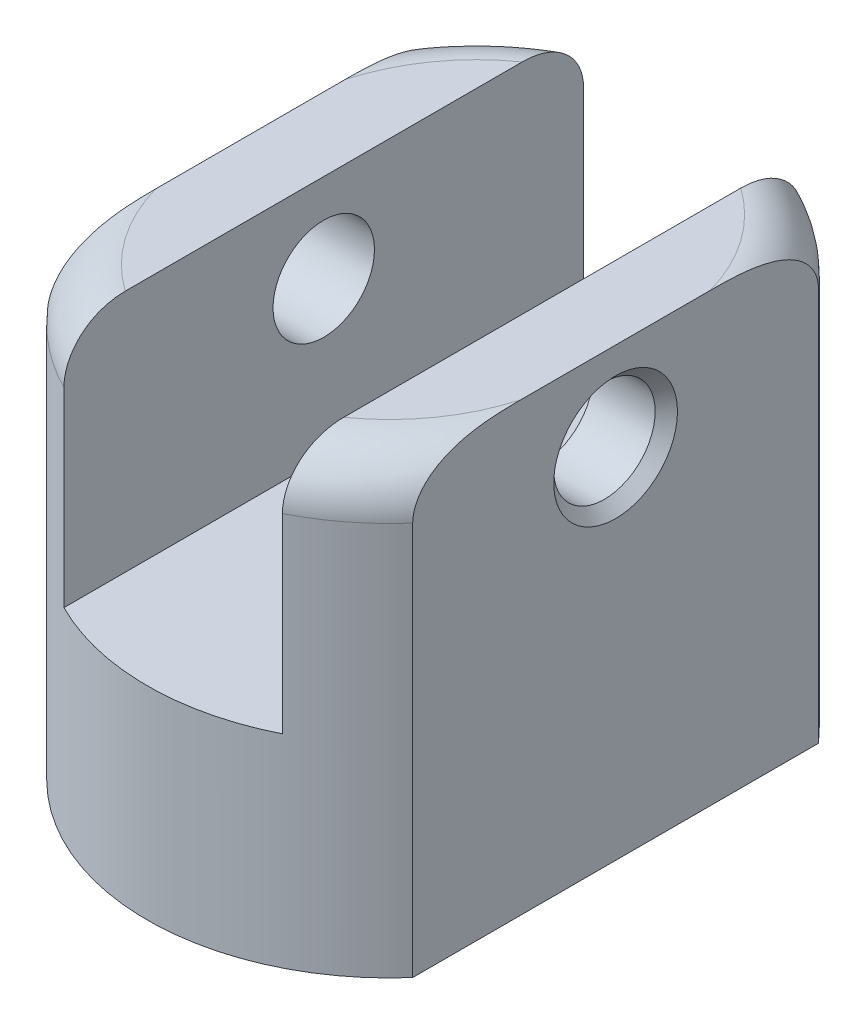
ISO-10303-21;
HEADER;
FILE_DESCRIPTION(('STEP AP214'),'2;1');
FILE_NAME('part.step','',(''),(''),'','','');
FILE_SCHEMA(('AUTOMOTIVE_DESIGN { 1 0 10303 214 1 1 1 1 }'));
ENDSEC;
DATA;
#1=APPLICATION_CONTEXT('core data for automotive mechanical design processes');
#2=APPLICATION_PROTOCOL_DEFINITION('international standard','automotive_design',2000,#1);
#3=PRODUCT_CONTEXT('',#1,'mechanical');
#4=PRODUCT('Part','Part','',(#3));
#5=PRODUCT_RELATED_PRODUCT_CATEGORY('part','',(#4));
#6=PRODUCT_DEFINITION_FORMATION('','',#4);
#7=PRODUCT_DEFINITION_CONTEXT('part definition',#1,'design');
#8=PRODUCT_DEFINITION('design','',#6,#7);
#9=PRODUCT_DEFINITION_SHAPE('','',#8);
#10=(LENGTH_UNIT() NAMED_UNIT(*) SI_UNIT(.MILLI.,.METRE.));
#11=(NAMED_UNIT(*) PLANE_ANGLE_UNIT() SI_UNIT($,.RADIAN.));
#12=(NAMED_UNIT(*) SI_UNIT($,.STERADIAN.) SOLID_ANGLE_UNIT());
#13=UNCERTAINTY_MEASURE_WITH_UNIT(LENGTH_MEASURE(1.E-05),#10,'distance_accuracy_value','');
#14=(GEOMETRIC_REPRESENTATION_CONTEXT(3) GLOBAL_UNCERTAINTY_ASSIGNED_CONTEXT((#13)) GLOBAL_UNIT_ASSIGNED_CONTEXT((#10,
#11,#12)) REPRESENTATION_CONTEXT('',''));
#15=CARTESIAN_POINT('',(0.,0.,0.));
#16=DIRECTION('',(0.,0.,1.));
#17=DIRECTION('',(1.,0.,0.));
#18=AXIS2_PLACEMENT_3D('',#15,#16,#17);
#19=CARTESIAN_POINT('',(0.,5.,-3.93010790379543));
#20=DIRECTION('',(0.,-1.,0.));
#21=DIRECTION('',(0.,0.,-1.));
#22=AXIS2_PLACEMENT_3D('',#19,#20,#21);
#23=CYLINDRICAL_SURFACE('',#22,5.97459188024381);
#24=DIRECTION('',(0.,-1.,0.));
#25=VECTOR('',#24,1.);
#26=CARTESIAN_POINT('',(4.5,5.,0.));
#27=LINE('',#26,#25);
#28=CARTESIAN_POINT('',(4.5,9.7,0.));
#29=VERTEX_POINT('',#28);
#30=CARTESIAN_POINT('',(4.5,0.,0.));
#31=VERTEX_POINT('',#30);
#32=EDGE_CURVE('E196',#29,#31,#27,.T.);
#33=ORIENTED_EDGE('',*,*,#32,.F.);
#34=CARTESIAN_POINT('',(0.,9.7,-3.93010790379543));
#35=DIRECTION('',(0.,-1.,0.));
#36=DIRECTION('',(0.,0.,-1.));
#37=AXIS2_PLACEMENT_3D('',#34,#35,#36);
#38=CIRCLE('',#37,5.97459188024381);
#39=CARTESIAN_POINT('',(2.69256177348422,9.7,1.40335806417013));
#40=VERTEX_POINT('',#39);
#41=EDGE_CURVE('E331',#29,#40,#38,.T.);
#42=ORIENTED_EDGE('',*,*,#41,.T.);
#43=DIRECTION('',(0.,-1.,0.));
#44=VECTOR('',#43,1.);
#45=CARTESIAN_POINT('',(2.69256177348422,11.,1.40335806417013));
#46=LINE('',#45,#44);
#47=CARTESIAN_POINT('',(2.69256177348422,5.,1.40335806417013));
#48=VERTEX_POINT('',#47);
#49=EDGE_CURVE('E171',#40,#48,#46,.T.);
#50=ORIENTED_EDGE('',*,*,#49,.T.);
#51=CARTESIAN_POINT('',(0.,5.,-3.93010790379543));
#52=DIRECTION('',(0.,1.,0.));
#53=DIRECTION('',(0.,0.,1.));
#54=AXIS2_PLACEMENT_3D('',#51,#52,#53);
#55=CIRCLE('',#54,5.97459188024381);
#56=CARTESIAN_POINT('',(-2.69256177348422,5.,1.40335806417013));
#57=VERTEX_POINT('',#56);
#58=EDGE_CURVE('E155',#57,#48,#55,.T.);
#59=ORIENTED_EDGE('',*,*,#58,.F.);
#60=DIRECTION('',(0.,-1.,0.));
#61=VECTOR('',#60,1.);
#62=CARTESIAN_POINT('',(-2.69256177348422,11.,1.40335806417013));
#63=LINE('',#62,#61);
#64=CARTESIAN_POINT('',(-2.69256177348422,9.7,1.40335806417013));
#65=VERTEX_POINT('',#64);
#66=EDGE_CURVE('E142',#65,#57,#63,.T.);
#67=ORIENTED_EDGE('',*,*,#66,.F.);
#68=CARTESIAN_POINT('',(0.,9.7,-3.93010790379543));
#69=DIRECTION('',(0.,1.,0.));
#70=DIRECTION('',(0.,0.,1.));
#71=AXIS2_PLACEMENT_3D('',#68,#69,#70);
#72=CIRCLE('',#71,5.97459188024381);
#73=CARTESIAN_POINT('',(-4.5,9.7,0.));
#74=VERTEX_POINT('',#73);
#75=EDGE_CURVE('E333',#65,#74,#72,.F.);
#76=ORIENTED_EDGE('',*,*,#75,.T.);
#77=DIRECTION('',(0.,-1.,0.));
#78=VECTOR('',#77,1.);
#79=CARTESIAN_POINT('',(-4.5,5.,0.));
#80=LINE('',#79,#78);
#81=CARTESIAN_POINT('',(-4.5,0.,0.));
#82=VERTEX_POINT('',#81);
#83=EDGE_CURVE('E154',#74,#82,#80,.T.);
#84=ORIENTED_EDGE('',*,*,#83,.T.);
#85=CARTESIAN_POINT('',(0.,0.,-3.93010790379543));
#86=DIRECTION('',(0.,1.,0.));
#87=DIRECTION('',(0.,0.,1.));
#88=AXIS2_PLACEMENT_3D('',#85,#86,#87);
#89=CIRCLE('',#88,5.97459188024381);
#90=EDGE_CURVE('E168',#82,#31,#89,.T.);
#91=ORIENTED_EDGE('',*,*,#90,.T.);
#92=EDGE_LOOP('',(#33,#42,#50,#59,#67,#76,#84,#91));
#93=FACE_BOUND('',#92,.T.);
#94=ADVANCED_FACE('F43',(#93),#23,.T.);
#95=CARTESIAN_POINT('',(4.5,5.,0.));
#96=DIRECTION('',(-1.,0.,0.));
#97=DIRECTION('',(0.,0.,1.));
#98=AXIS2_PLACEMENT_3D('',#95,#96,#97);
#99=PLANE('',#98);
#100=CARTESIAN_POINT('',(4.5,8.81884783153052,-5.));
#101=DIRECTION('',(1.,0.,0.));
#102=DIRECTION('',(0.,0.,-1.));
#103=AXIS2_PLACEMENT_3D('',#100,#101,#102);
#104=CIRCLE('',#103,1.525);
#105=CARTESIAN_POINT('',(4.5,8.81884783153052,-6.525));
#106=VERTEX_POINT('',#105);
#107=EDGE_CURVE('E360',#106,#106,#104,.T.);
#108=ORIENTED_EDGE('',*,*,#107,.F.);
#109=EDGE_LOOP('',(#108));
#110=FACE_BOUND('',#109,.T.);
#111=DIRECTION('',(0.,0.,-1.));
#112=VECTOR('',#111,1.);
#113=CARTESIAN_POINT('',(4.5,11.,-10.));
#114=LINE('',#113,#112);
#115=CARTESIAN_POINT('',(4.5,11.,-2.66448187417949));
#116=VERTEX_POINT('',#115);
#117=CARTESIAN_POINT('',(4.5,11.,-7.33551812582051));
#118=VERTEX_POINT('',#117);
#119=EDGE_CURVE('E173',#116,#118,#114,.T.);
#120=ORIENTED_EDGE('',*,*,#119,.F.);
#121=CARTESIAN_POINT('',(4.5,11.,-2.66448187417949));
#122=CARTESIAN_POINT('',(4.5,10.9999579121948,-2.55721604428464));
#123=CARTESIAN_POINT('',(4.5,10.9990249247275,-2.44989611380565));
#124=CARTESIAN_POINT('',(4.5,10.9936863313358,-2.23497742128847));
#125=CARTESIAN_POINT('',(4.5,10.9892686333236,-2.12737899112895));
#126=CARTESIAN_POINT('',(4.5,10.9751204791902,-1.91055119010271));
#127=CARTESIAN_POINT('',(4.5,10.9652959213955,-1.80132728218169));
#128=CARTESIAN_POINT('',(4.5,10.9381548415997,-1.58392520500035));
#129=CARTESIAN_POINT('',(4.5,10.9208496516396,-1.47574570602313));
#130=CARTESIAN_POINT('',(4.5,10.8769295805703,-1.26434897871217));
#131=CARTESIAN_POINT('',(4.5,10.8505863707531,-1.16107735247381));
#132=CARTESIAN_POINT('',(4.5,10.7859985310876,-0.95851005137638));
#133=CARTESIAN_POINT('',(4.5,10.7477915897003,-0.85920289418209));
#134=CARTESIAN_POINT('',(4.5,10.6647247234272,-0.68449316896437));
#135=CARTESIAN_POINT('',(4.5,10.6222478314166,-0.607975418394366));
#136=CARTESIAN_POINT('',(4.5,10.5257477093161,-0.462490874733668));
#137=CARTESIAN_POINT('',(4.5,10.4717423395854,-0.393512648257315));
#138=CARTESIAN_POINT('',(4.5,10.3697128469543,-0.28669384561602));
#139=CARTESIAN_POINT('',(4.5,10.324913840388,-0.245783392721529));
#140=CARTESIAN_POINT('',(4.5,10.2293848147684,-0.171530438212447));
#141=CARTESIAN_POINT('',(4.5,10.1786608124376,-0.138180358691917));
#142=CARTESIAN_POINT('',(4.5,10.0800092926009,-0.0853978250752117));
#143=CARTESIAN_POINT('',(4.5,10.0327986058323,-0.0646296827384352));
#144=CARTESIAN_POINT('',(4.5,9.93558660259112,-0.0313069185272241));
#145=CARTESIAN_POINT('',(4.5,9.88559082644872,-0.01873658058308));
#146=CARTESIAN_POINT('',(4.5,9.81261753340674,-0.00713469799353471));
#147=CARTESIAN_POINT('',(4.5,9.79017466386443,-0.00446323250953511));
#148=CARTESIAN_POINT('',(4.5,9.74515841519744,-0.000895803752150439));
#149=CARTESIAN_POINT('',(4.5,9.72258509819915,9.44439139875433E-07));
#150=CARTESIAN_POINT('',(4.5,9.7,0.));
#151=B_SPLINE_CURVE_WITH_KNOTS('',3,(#121,#122,#123,#124,#125,#126,#127,#128,#129,#130,#131,
#132,#133,#134,#135,#136,#137,#138,#139,#140,#141,#142,#143,#144,#145,#146,#147,#148,#149,#150),
.UNSPECIFIED.,.F.,.F.,(4,2,2,2,2,2,2,2,2,2,2,2,2,2,4),(0.,0.321878742921493,0.644879358068709,
0.973687927740611,1.30200013749144,1.62120164235244,1.93939931314231,2.20114254324101,
2.46248317606112,2.64386775823326,2.82506972334543,2.97916426119044,3.13296250803396,
3.20070705697702,3.26842163731411),.UNSPECIFIED.);
#152=EDGE_CURVE('E212',#116,#29,#151,.T.);
#153=ORIENTED_EDGE('',*,*,#152,.T.);
#154=ORIENTED_EDGE('',*,*,#32,.T.);
#155=DIRECTION('',(0.,0.,-1.));
#156=VECTOR('',#155,1.);
#157=CARTESIAN_POINT('',(4.5,0.,0.));
#158=LINE('',#157,#156);
#159=CARTESIAN_POINT('',(4.5,0.,-10.));
#160=VERTEX_POINT('',#159);
#161=EDGE_CURVE('E183',#31,#160,#158,.T.);
#162=ORIENTED_EDGE('',*,*,#161,.T.);
#163=DIRECTION('',(0.,-1.,0.));
#164=VECTOR('',#163,1.);
#165=CARTESIAN_POINT('',(4.5,5.,-10.));
#166=LINE('',#165,#164);
#167=CARTESIAN_POINT('',(4.5,9.7,-10.));
#168=VERTEX_POINT('',#167);
#169=EDGE_CURVE('E194',#168,#160,#166,.T.);
#170=ORIENTED_EDGE('',*,*,#169,.F.);
#171=CARTESIAN_POINT('',(4.5,9.7,-10.));
#172=CARTESIAN_POINT('',(4.5,9.72733090783955,-10.0000047047525));
#173=CARTESIAN_POINT('',(4.5,9.75464478026116,-9.9986885596798));
#174=CARTESIAN_POINT('',(4.5,9.80900483720851,-9.99347201786908));
#175=CARTESIAN_POINT('',(4.5,9.83605120434967,-9.98957352832161));
#176=CARTESIAN_POINT('',(4.5,9.91600090924396,-9.97418364695842));
#177=CARTESIAN_POINT('',(4.5,9.9682307709006,-9.95899539511455));
#178=CARTESIAN_POINT('',(4.5,10.0690705493207,-9.91989447850897));
#179=CARTESIAN_POINT('',(4.5,10.1176895456887,-9.8960046546433));
#180=CARTESIAN_POINT('',(4.5,10.2106744455297,-9.84091029559183));
#181=CARTESIAN_POINT('',(4.5,10.2550305369458,-9.80968942894652));
#182=CARTESIAN_POINT('',(4.5,10.3555240260043,-9.72796077291403));
#183=CARTESIAN_POINT('',(4.5,10.4094179177737,-9.67470046463676));
#184=CARTESIAN_POINT('',(4.5,10.5079488884731,-9.56034581127658));
#185=CARTESIAN_POINT('',(4.5,10.5525767422687,-9.49924375603809));
#186=CARTESIAN_POINT('',(4.5,10.6548092426531,-9.33791127604358));
#187=CARTESIAN_POINT('',(4.5,10.7067583533449,-9.2341043453775));
#188=CARTESIAN_POINT('',(4.5,10.7726106143044,-9.07334225145411));
#189=CARTESIAN_POINT('',(4.5,10.7926082649215,-9.01867005432249));
#190=CARTESIAN_POINT('',(4.5,10.8289559665313,-8.90813296909866));
#191=CARTESIAN_POINT('',(4.5,10.845307398349,-8.85226854131669));
#192=CARTESIAN_POINT('',(4.5,10.8916851049158,-8.67533214421918));
#193=CARTESIAN_POINT('',(4.5,10.9159616737409,-8.55275875961463));
#194=CARTESIAN_POINT('',(4.5,10.9537131362733,-8.30578537036689));
#195=CARTESIAN_POINT('',(4.5,10.9671592785388,-8.18138139063602));
#196=CARTESIAN_POINT('',(4.5,10.9861045566522,-7.93641050029632));
#197=CARTESIAN_POINT('',(4.5,10.9918661760798,-7.81586225205154));
#198=CARTESIAN_POINT('',(4.5,10.9970699359626,-7.63531636318941));
#199=CARTESIAN_POINT('',(4.5,10.998232964284,-7.57535362511535));
#200=CARTESIAN_POINT('',(4.5,10.9996963268643,-7.45543320140376));
#201=CARTESIAN_POINT('',(4.5,10.9999968943528,-7.39547551878566));
#202=CARTESIAN_POINT('',(4.5,11.,-7.33551812582051));
#203=B_SPLINE_CURVE_WITH_KNOTS('',3,(#171,#172,#173,#174,#175,#176,#177,#178,#179,#180,#181,
#182,#183,#184,#185,#186,#187,#188,#189,#190,#191,#192,#193,#194,#195,#196,#197,#198,#199,#200,
#201,#202),.UNSPECIFIED.,.F.,.F.,(4,2,2,2,2,2,2,2,2,2,2,2,2,2,2,4),(0.,0.0819287032707459,
0.163796965461516,0.326010462989273,0.487801196599493,0.649955831433167,0.875997141181808,
1.10226242660355,1.44843033047372,1.62300215620742,1.79750775879397,2.17160379172487,
2.54668969102926,2.90860421367894,3.08852303005002,3.26839318757344),.UNSPECIFIED.);
#204=EDGE_CURVE('E204',#168,#118,#203,.T.);
#205=ORIENTED_EDGE('',*,*,#204,.T.);
#206=EDGE_LOOP('',(#120,#153,#154,#162,#170,#205));
#207=FACE_BOUND('',#206,.T.);
#208=ADVANCED_FACE('F221',(#110,#207),#99,.F.);
#209=CARTESIAN_POINT('',(0.,5.,-6.06989209620457));
#210=DIRECTION('',(0.,-1.,0.));
#211=DIRECTION('',(0.,0.,-1.));
#212=AXIS2_PLACEMENT_3D('',#209,#210,#211);
#213=CYLINDRICAL_SURFACE('',#212,5.97459188024381);
#214=DIRECTION('',(0.,-1.,0.));
#215=VECTOR('',#214,1.);
#216=CARTESIAN_POINT('',(2.69256177348422,11.,-11.4033580641701));
#217=LINE('',#216,#215);
#218=CARTESIAN_POINT('',(2.69256177348422,9.7,-11.4033580641701));
#219=VERTEX_POINT('',#218);
#220=CARTESIAN_POINT('',(2.69256177348422,5.,-11.4033580641701));
#221=VERTEX_POINT('',#220);
#222=EDGE_CURVE('E169',#219,#221,#217,.T.);
#223=ORIENTED_EDGE('',*,*,#222,.F.);
#224=CARTESIAN_POINT('',(0.,9.7,-6.06989209620457));
#225=DIRECTION('',(0.,-1.,0.));
#226=DIRECTION('',(0.,0.,-1.));
#227=AXIS2_PLACEMENT_3D('',#224,#225,#226);
#228=CIRCLE('',#227,5.97459188024381);
#229=EDGE_CURVE('E315',#219,#168,#228,.T.);
#230=ORIENTED_EDGE('',*,*,#229,.T.);
#231=ORIENTED_EDGE('',*,*,#169,.T.);
#232=CARTESIAN_POINT('',(0.,0.,-6.06989209620457));
#233=DIRECTION('',(0.,1.,0.));
#234=DIRECTION('',(0.,0.,-1.));
#235=AXIS2_PLACEMENT_3D('',#232,#233,#234);
#236=CIRCLE('',#235,5.97459188024381);
#237=CARTESIAN_POINT('',(-4.5,0.,-10.));
#238=VERTEX_POINT('',#237);
#239=EDGE_CURVE('E186',#160,#238,#236,.T.);
#240=ORIENTED_EDGE('',*,*,#239,.T.);
#241=DIRECTION('',(0.,-1.,0.));
#242=VECTOR('',#241,1.);
#243=CARTESIAN_POINT('',(-4.5,5.,-10.));
#244=LINE('',#243,#242);
#245=CARTESIAN_POINT('',(-4.5,9.7,-10.));
#246=VERTEX_POINT('',#245);
#247=EDGE_CURVE('E192',#246,#238,#244,.T.);
#248=ORIENTED_EDGE('',*,*,#247,.F.);
#249=CARTESIAN_POINT('',(0.,9.7,-6.06989209620457));
#250=DIRECTION('',(0.,1.,0.));
#251=DIRECTION('',(0.,0.,1.));
#252=AXIS2_PLACEMENT_3D('',#249,#250,#251);
#253=CIRCLE('',#252,5.97459188024381);
#254=CARTESIAN_POINT('',(-2.69256177348422,9.7,-11.4033580641701));
#255=VERTEX_POINT('',#254);
#256=EDGE_CURVE('E140',#246,#255,#253,.F.);
#257=ORIENTED_EDGE('',*,*,#256,.T.);
#258=DIRECTION('',(0.,-1.,0.));
#259=VECTOR('',#258,1.);
#260=CARTESIAN_POINT('',(-2.69256177348422,11.,-11.4033580641701));
#261=LINE('',#260,#259);
#262=CARTESIAN_POINT('',(-2.69256177348422,5.,-11.4033580641701));
#263=VERTEX_POINT('',#262);
#264=EDGE_CURVE('E133',#255,#263,#261,.T.);
#265=ORIENTED_EDGE('',*,*,#264,.T.);
#266=CARTESIAN_POINT('',(0.,5.,-6.06989209620457));
#267=DIRECTION('',(0.,1.,0.));
#268=DIRECTION('',(0.,0.,-1.));
#269=AXIS2_PLACEMENT_3D('',#266,#267,#268);
#270=CIRCLE('',#269,5.97459188024381);
#271=EDGE_CURVE('E137',#221,#263,#270,.T.);
#272=ORIENTED_EDGE('',*,*,#271,.F.);
#273=EDGE_LOOP('',(#223,#230,#231,#240,#248,#257,#265,#272));
#274=FACE_BOUND('',#273,.T.);
#275=ADVANCED_FACE('F136',(#274),#213,.T.);
#276=CARTESIAN_POINT('',(-4.5,5.,0.));
#277=DIRECTION('',(1.,0.,0.));
#278=DIRECTION('',(0.,0.,-1.));
#279=AXIS2_PLACEMENT_3D('',#276,#277,#278);
#280=PLANE('',#279);
#281=CARTESIAN_POINT('',(-4.5,8.81884783153052,-5.));
#282=DIRECTION('',(1.,0.,0.));
#283=DIRECTION('',(0.,0.,-1.));
#284=AXIS2_PLACEMENT_3D('',#281,#282,#283);
#285=CIRCLE('',#284,1.25);
#286=CARTESIAN_POINT('',(-4.5,8.81884783153052,-6.25));
#287=VERTEX_POINT('',#286);
#288=EDGE_CURVE('E362',#287,#287,#285,.T.);
#289=ORIENTED_EDGE('',*,*,#288,.T.);
#290=EDGE_LOOP('',(#289));
#291=FACE_BOUND('',#290,.T.);
#292=DIRECTION('',(0.,0.,1.));
#293=VECTOR('',#292,1.);
#294=CARTESIAN_POINT('',(-4.5,11.,-10.));
#295=LINE('',#294,#293);
#296=CARTESIAN_POINT('',(-4.5,11.,-7.33551812582051));
#297=VERTEX_POINT('',#296);
#298=CARTESIAN_POINT('',(-4.5,11.,-2.66448187417949));
#299=VERTEX_POINT('',#298);
#300=EDGE_CURVE('E159',#297,#299,#295,.T.);
#301=ORIENTED_EDGE('',*,*,#300,.F.);
#302=CARTESIAN_POINT('',(-4.5,11.,-7.33551812582051));
#303=CARTESIAN_POINT('',(-4.5,10.9999579121948,-7.44278395571536));
#304=CARTESIAN_POINT('',(-4.5,10.9990249247275,-7.55010388619435));
#305=CARTESIAN_POINT('',(-4.5,10.9936863313358,-7.76502257871152));
#306=CARTESIAN_POINT('',(-4.5,10.9892686333236,-7.87262100887105));
#307=CARTESIAN_POINT('',(-4.5,10.9751204791902,-8.08944880989729));
#308=CARTESIAN_POINT('',(-4.5,10.9652959213955,-8.19867271781831));
#309=CARTESIAN_POINT('',(-4.5,10.9381548415997,-8.41607479499965));
#310=CARTESIAN_POINT('',(-4.5,10.9208496516396,-8.52425429397687));
#311=CARTESIAN_POINT('',(-4.5,10.8769295805703,-8.73565102128783));
#312=CARTESIAN_POINT('',(-4.5,10.8505863707531,-8.83892264752619));
#313=CARTESIAN_POINT('',(-4.5,10.7859985310876,-9.04148994862362));
#314=CARTESIAN_POINT('',(-4.5,10.7477915897003,-9.14079710581791));
#315=CARTESIAN_POINT('',(-4.5,10.6647247234272,-9.31550683103563));
#316=CARTESIAN_POINT('',(-4.5,10.6222478314166,-9.39202458160564));
#317=CARTESIAN_POINT('',(-4.5,10.5257477093161,-9.53750912526633));
#318=CARTESIAN_POINT('',(-4.5,10.4717423395854,-9.60648735174269));
#319=CARTESIAN_POINT('',(-4.5,10.3697128469543,-9.71330615438398));
#320=CARTESIAN_POINT('',(-4.5,10.324913840388,-9.75421660727847));
#321=CARTESIAN_POINT('',(-4.5,10.2293848147684,-9.82846956178755));
#322=CARTESIAN_POINT('',(-4.5,10.1786608124376,-9.86181964130808));
#323=CARTESIAN_POINT('',(-4.5,10.0800092926009,-9.91460217492479));
#324=CARTESIAN_POINT('',(-4.5,10.0327986058323,-9.93537031726157));
#325=CARTESIAN_POINT('',(-4.5,9.93558660259112,-9.96869308147278));
#326=CARTESIAN_POINT('',(-4.5,9.88559082644871,-9.98126341941692));
#327=CARTESIAN_POINT('',(-4.5,9.81261753340674,-9.99286530200646));
#328=CARTESIAN_POINT('',(-4.5,9.79017466386443,-9.99553676749046));
#329=CARTESIAN_POINT('',(-4.5,9.74515841519744,-9.99910419624785));
#330=CARTESIAN_POINT('',(-4.5,9.72258509819915,-10.0000009444391));
#331=CARTESIAN_POINT('',(-4.5,9.7,-10.));
#332=B_SPLINE_CURVE_WITH_KNOTS('',3,(#302,#303,#304,#305,#306,#307,#308,#309,#310,#311,#312,
#313,#314,#315,#316,#317,#318,#319,#320,#321,#322,#323,#324,#325,#326,#327,#328,#329,#330,#331),
.UNSPECIFIED.,.F.,.F.,(4,2,2,2,2,2,2,2,2,2,2,2,2,2,4),(0.,0.32187874292149,0.644879358068706,
0.973687927740607,1.30200013749143,1.62120164235244,1.93939931314231,2.20114254324101,
2.46248317606112,2.64386775823326,2.82506972334543,2.97916426119044,3.13296250803396,
3.20070705697702,3.26842163731411),.UNSPECIFIED.);
#333=EDGE_CURVE('E284',#297,#246,#332,.T.);
#334=ORIENTED_EDGE('',*,*,#333,.T.);
#335=ORIENTED_EDGE('',*,*,#247,.T.);
#336=DIRECTION('',(0.,0.,1.));
#337=VECTOR('',#336,1.);
#338=CARTESIAN_POINT('',(-4.5,0.,0.));
#339=LINE('',#338,#337);
#340=EDGE_CURVE('E179',#238,#82,#339,.T.);
#341=ORIENTED_EDGE('',*,*,#340,.T.);
#342=ORIENTED_EDGE('',*,*,#83,.F.);
#343=CARTESIAN_POINT('',(-4.5,9.7,0.));
#344=CARTESIAN_POINT('',(-4.5,9.72733090783955,4.70475250932631E-06));
#345=CARTESIAN_POINT('',(-4.5,9.75464478026116,-0.00131144032019838));
#346=CARTESIAN_POINT('',(-4.5,9.80900483720851,-0.006527982130916));
#347=CARTESIAN_POINT('',(-4.5,9.83605120434967,-0.010426471678393));
#348=CARTESIAN_POINT('',(-4.5,9.91600090924396,-0.0258163530415726));
#349=CARTESIAN_POINT('',(-4.5,9.9682307709006,-0.0410046048854452));
#350=CARTESIAN_POINT('',(-4.5,10.0690705493207,-0.0801055214910304));
#351=CARTESIAN_POINT('',(-4.5,10.1176895456887,-0.103995345356704));
#352=CARTESIAN_POINT('',(-4.5,10.2106744455297,-0.159089704408168));
#353=CARTESIAN_POINT('',(-4.5,10.2550305369458,-0.190310571053476));
#354=CARTESIAN_POINT('',(-4.5,10.3555240260043,-0.272039227085967));
#355=CARTESIAN_POINT('',(-4.5,10.4094179177737,-0.325299535363239));
#356=CARTESIAN_POINT('',(-4.5,10.5079488884731,-0.439654188723425));
#357=CARTESIAN_POINT('',(-4.5,10.5525767422687,-0.500756243961912));
#358=CARTESIAN_POINT('',(-4.5,10.6548092426531,-0.662088723956429));
#359=CARTESIAN_POINT('',(-4.5,10.7067583533449,-0.765895654622503));
#360=CARTESIAN_POINT('',(-4.5,10.7726106143044,-0.926657748545895));
#361=CARTESIAN_POINT('',(-4.5,10.7926082649215,-0.981329945677521));
#362=CARTESIAN_POINT('',(-4.5,10.8289559665313,-1.09186703090135));
#363=CARTESIAN_POINT('',(-4.5,10.845307398349,-1.14773145868332));
#364=CARTESIAN_POINT('',(-4.5,10.8916851049158,-1.32466785578083));
#365=CARTESIAN_POINT('',(-4.5,10.9159616737409,-1.44724124038538));
#366=CARTESIAN_POINT('',(-4.5,10.9537131362733,-1.69421462963312));
#367=CARTESIAN_POINT('',(-4.5,10.9671592785388,-1.81861860936399));
#368=CARTESIAN_POINT('',(-4.5,10.9861045566522,-2.06358949970369));
#369=CARTESIAN_POINT('',(-4.5,10.9918661760798,-2.18413774794846));
#370=CARTESIAN_POINT('',(-4.5,10.9970699359626,-2.36468363681059));
#371=CARTESIAN_POINT('',(-4.5,10.998232964284,-2.42464637488465));
#372=CARTESIAN_POINT('',(-4.5,10.9996963268643,-2.54456679859624));
#373=CARTESIAN_POINT('',(-4.5,10.9999968943528,-2.60452448121434));
#374=CARTESIAN_POINT('',(-4.5,11.,-2.66448187417949));
#375=B_SPLINE_CURVE_WITH_KNOTS('',3,(#343,#344,#345,#346,#347,#348,#349,#350,#351,#352,#353,
#354,#355,#356,#357,#358,#359,#360,#361,#362,#363,#364,#365,#366,#367,#368,#369,#370,#371,#372,
#373,#374),.UNSPECIFIED.,.F.,.F.,(4,2,2,2,2,2,2,2,2,2,2,2,2,2,2,4),(0.,0.0819287032707458,
0.163796965461517,0.326010462989273,0.487801196599491,0.649955831433167,0.875997141181811,
1.10226242660355,1.44843033047373,1.62300215620743,1.79750775879398,2.17160379172488,
2.54668969102927,2.90860421367894,3.08852303005002,3.26839318757344),.UNSPECIFIED.);
#376=EDGE_CURVE('E277',#74,#299,#375,.T.);
#377=ORIENTED_EDGE('',*,*,#376,.T.);
#378=EDGE_LOOP('',(#301,#334,#335,#341,#342,#377));
#379=FACE_BOUND('',#378,.T.);
#380=ADVANCED_FACE('F269',(#291,#379),#280,.F.);
#381=CARTESIAN_POINT('',(0.,5.,-3.93010790379543));
#382=DIRECTION('',(0.,1.,0.));
#383=DIRECTION('',(0.,0.,1.));
#384=AXIS2_PLACEMENT_3D('',#381,#382,#383);
#385=PLANE('',#384);
#386=DIRECTION('',(0.,0.,-1.));
#387=VECTOR('',#386,1.);
#388=CARTESIAN_POINT('',(-2.69256177348422,5.,-11.4033580641701));
#389=LINE('',#388,#387);
#390=EDGE_CURVE('E150',#57,#263,#389,.T.);
#391=ORIENTED_EDGE('',*,*,#390,.F.);
#392=ORIENTED_EDGE('',*,*,#58,.T.);
#393=DIRECTION('',(0.,0.,1.));
#394=VECTOR('',#393,1.);
#395=CARTESIAN_POINT('',(2.69256177348422,5.,-11.4033580641701));
#396=LINE('',#395,#394);
#397=EDGE_CURVE('E153',#221,#48,#396,.T.);
#398=ORIENTED_EDGE('',*,*,#397,.F.);
#399=ORIENTED_EDGE('',*,*,#271,.T.);
#400=EDGE_LOOP('',(#391,#392,#398,#399));
#401=FACE_BOUND('',#400,.T.);
#402=ADVANCED_FACE('F148',(#401),#385,.T.);
#403=CARTESIAN_POINT('',(0.,0.,-3.93010790379543));
#404=DIRECTION('',(0.,1.,0.));
#405=DIRECTION('',(0.,0.,1.));
#406=AXIS2_PLACEMENT_3D('',#403,#404,#405);
#407=PLANE('',#406);
#408=ORIENTED_EDGE('',*,*,#90,.F.);
#409=ORIENTED_EDGE('',*,*,#340,.F.);
#410=ORIENTED_EDGE('',*,*,#239,.F.);
#411=ORIENTED_EDGE('',*,*,#161,.F.);
#412=EDGE_LOOP('',(#408,#409,#410,#411));
#413=FACE_BOUND('',#412,.T.);
#414=ADVANCED_FACE('F259',(#413),#407,.F.);
#415=CARTESIAN_POINT('',(2.69256177348422,11.,-11.4033580641701));
#416=DIRECTION('',(1.,0.,0.));
#417=DIRECTION('',(0.,0.,-1.));
#418=AXIS2_PLACEMENT_3D('',#415,#416,#417);
#419=PLANE('',#418);
#420=CARTESIAN_POINT('',(2.69256177348422,8.81884783153052,-5.));
#421=DIRECTION('',(1.,0.,0.));
#422=DIRECTION('',(0.,0.,-1.));
#423=AXIS2_PLACEMENT_3D('',#420,#421,#422);
#424=CIRCLE('',#423,1.25);
#425=CARTESIAN_POINT('',(2.69256177348422,8.81884783153052,-6.25));
#426=VERTEX_POINT('',#425);
#427=EDGE_CURVE('E172',#426,#426,#424,.T.);
#428=ORIENTED_EDGE('',*,*,#427,.T.);
#429=EDGE_LOOP('',(#428));
#430=FACE_BOUND('',#429,.T.);
#431=ORIENTED_EDGE('',*,*,#49,.F.);
#432=CARTESIAN_POINT('',(2.69256177348422,9.7,1.40335806417013));
#433=CARTESIAN_POINT('',(2.69256177348422,9.7335623016902,1.40335937402097));
#434=CARTESIAN_POINT('',(2.69256177348422,9.7671076306384,1.40190105072516));
#435=CARTESIAN_POINT('',(2.69256177348422,9.83393972316024,1.39609382569142));
#436=CARTESIAN_POINT('',(2.69256177348422,9.86722654284316,1.39174557001802));
#437=CARTESIAN_POINT('',(2.69256177348422,9.96611446300178,1.37445523591435));
#438=CARTESIAN_POINT('',(2.69256177348422,10.0310212241643,1.35726704118688));
#439=CARTESIAN_POINT('',(2.69256177348422,10.1569650612502,1.31228482460407));
#440=CARTESIAN_POINT('',(2.69256177348422,10.2180035336737,1.28449465592064));
#441=CARTESIAN_POINT('',(2.69256177348422,10.3347944406477,1.21939046438202));
#442=CARTESIAN_POINT('',(2.69256177348422,10.3905439935025,1.18207129001027));
#443=CARTESIAN_POINT('',(2.69256177348422,10.4974167244619,1.09778238962492));
#444=CARTESIAN_POINT('',(2.69256177348422,10.5483067214566,1.05051817369783));
#445=CARTESIAN_POINT('',(2.69256177348422,10.6422746334913,0.948823089176435));
#446=CARTESIAN_POINT('',(2.69256177348422,10.6853525939036,0.894392262209072));
#447=CARTESIAN_POINT('',(2.69256177348422,10.767089635545,0.774273368627876));
#448=CARTESIAN_POINT('',(2.69256177348422,10.8048929982102,0.70800446375797));
#449=CARTESIAN_POINT('',(2.69256177348422,10.8703881605465,0.570558334400867));
#450=CARTESIAN_POINT('',(2.69256177348422,10.8980624830823,0.499372875806103));
#451=CARTESIAN_POINT('',(2.69256177348422,10.9476990035381,0.340021671072733));
#452=CARTESIAN_POINT('',(2.69256177348422,10.9675641833571,0.251207361168992));
#453=CARTESIAN_POINT('',(2.69256177348422,10.9937121257623,0.0719047687031099));
#454=CARTESIAN_POINT('',(2.69256177348422,11.0000438095788,-0.0185762879436184));
#455=CARTESIAN_POINT('',(2.69256177348422,11.,-0.10886198880737));
#456=B_SPLINE_CURVE_WITH_KNOTS('',3,(#432,#433,#434,#435,#436,#437,#438,#439,#440,#441,#442,
#443,#444,#445,#446,#447,#448,#449,#450,#451,#452,#453,#454,#455),.UNSPECIFIED.,.F.,.F.,(4,2,2,
2,2,2,2,2,2,2,2,4),(0.,0.100621957358393,0.20122142753962,0.401596911253609,0.601899639951008,
0.802310885284356,1.00980603345451,1.21729997645157,1.44527233605951,1.67363621623183,
1.94556730717667,2.21651374044449),.UNSPECIFIED.);
#457=CARTESIAN_POINT('',(2.69256177348422,11.,-0.108861988807371));
#458=VERTEX_POINT('',#457);
#459=EDGE_CURVE('E238',#40,#458,#456,.T.);
#460=ORIENTED_EDGE('',*,*,#459,.T.);
#461=DIRECTION('',(0.,0.,1.));
#462=VECTOR('',#461,1.);
#463=CARTESIAN_POINT('',(2.69256177348422,11.,-11.4033580641701));
#464=LINE('',#463,#462);
#465=CARTESIAN_POINT('',(2.69256177348422,11.,-9.89113801119263));
#466=VERTEX_POINT('',#465);
#467=EDGE_CURVE('E163',#466,#458,#464,.T.);
#468=ORIENTED_EDGE('',*,*,#467,.F.);
#469=CARTESIAN_POINT('',(2.69256177348422,11.,-9.89113801119263));
#470=CARTESIAN_POINT('',(2.69256177348422,10.9999910994222,-9.94638552530487));
#471=CARTESIAN_POINT('',(2.69256177348422,10.9976429466683,-10.0016069699636));
#472=CARTESIAN_POINT('',(2.69256177348422,10.9880381459551,-10.1117046393189));
#473=CARTESIAN_POINT('',(2.69256177348422,10.9807738181725,-10.1665801880969));
#474=CARTESIAN_POINT('',(2.69256177348422,10.9512185023382,-10.3302772716477));
#475=CARTESIAN_POINT('',(2.69256177348422,10.9211627287602,-10.4378695666475));
#476=CARTESIAN_POINT('',(2.69256177348422,10.8501779886464,-10.6174443031307));
#477=CARTESIAN_POINT('',(2.69256177348422,10.8141366927867,-10.6913898119377));
#478=CARTESIAN_POINT('',(2.69256177348422,10.730380733329,-10.8322235305717));
#479=CARTESIAN_POINT('',(2.69256177348422,10.6826927536698,-10.8991273792501));
#480=CARTESIAN_POINT('',(2.69256177348422,10.575821729034,-11.0238747184675));
#481=CARTESIAN_POINT('',(2.69256177348422,10.516564075819,-11.0816547470151));
#482=CARTESIAN_POINT('',(2.69256177348422,10.3880448154007,-11.1849304457427));
#483=CARTESIAN_POINT('',(2.69256177348422,10.3187807036406,-11.2304230322449));
#484=CARTESIAN_POINT('',(2.69256177348422,10.1808023137459,-11.3022948423692));
#485=CARTESIAN_POINT('',(2.69256177348422,10.1129057553767,-11.3302502935999));
#486=CARTESIAN_POINT('',(2.69256177348422,9.97319449431727,-11.3731261365506));
#487=CARTESIAN_POINT('',(2.69256177348422,9.90138961311744,-11.3880777330283));
#488=CARTESIAN_POINT('',(2.69256177348422,9.8075180271727,-11.3985708694711));
#489=CARTESIAN_POINT('',(2.69256177348422,9.78603695678433,-11.4003664011699));
#490=CARTESIAN_POINT('',(2.69256177348422,9.74304069886786,-11.4027581930553));
#491=CARTESIAN_POINT('',(2.69256177348422,9.72152561204931,-11.4033562626236));
#492=CARTESIAN_POINT('',(2.69256177348422,9.7,-11.4033580641702));
#493=B_SPLINE_CURVE_WITH_KNOTS('',3,(#469,#470,#471,#472,#473,#474,#475,#476,#477,#478,#479,
#480,#481,#482,#483,#484,#485,#486,#487,#488,#489,#490,#491,#492),.UNSPECIFIED.,.F.,.F.,(4,2,2,
2,2,2,2,2,2,2,2,4),(0.,0.165629376443122,0.331518090581088,0.664181696668875,0.909990824085433,
1.15524197149133,1.40213024811752,1.64908042680793,1.86820026400616,2.08679282696081,
2.15143810159491,2.21598562238553),.UNSPECIFIED.);
#494=EDGE_CURVE('E246',#466,#219,#493,.T.);
#495=ORIENTED_EDGE('',*,*,#494,.T.);
#496=ORIENTED_EDGE('',*,*,#222,.T.);
#497=ORIENTED_EDGE('',*,*,#397,.T.);
#498=EDGE_LOOP('',(#431,#460,#468,#495,#496,#497));
#499=FACE_BOUND('',#498,.T.);
#500=ADVANCED_FACE('F253',(#430,#499),#419,.F.);
#501=CARTESIAN_POINT('',(0.,11.,-6.06989209620457));
#502=DIRECTION('',(0.,-1.,0.));
#503=DIRECTION('',(0.,0.,-1.));
#504=AXIS2_PLACEMENT_3D('',#501,#502,#503);
#505=PLANE('',#504);
#506=ORIENTED_EDGE('',*,*,#467,.T.);
#507=CARTESIAN_POINT('',(0.,11.,-3.93010790379543));
#508=DIRECTION('',(0.,-1.,0.));
#509=DIRECTION('',(0.,0.,-1.));
#510=AXIS2_PLACEMENT_3D('',#507,#508,#509);
#511=CIRCLE('',#510,4.67459188024381);
#512=EDGE_CURVE('E201',#458,#116,#511,.F.);
#513=ORIENTED_EDGE('',*,*,#512,.T.);
#514=ORIENTED_EDGE('',*,*,#119,.T.);
#515=CARTESIAN_POINT('',(0.,11.,-6.06989209620457));
#516=DIRECTION('',(0.,-1.,0.));
#517=DIRECTION('',(0.,0.,-1.));
#518=AXIS2_PLACEMENT_3D('',#515,#516,#517);
#519=CIRCLE('',#518,4.67459188024381);
#520=EDGE_CURVE('E198',#118,#466,#519,.F.);
#521=ORIENTED_EDGE('',*,*,#520,.T.);
#522=EDGE_LOOP('',(#506,#513,#514,#521));
#523=FACE_BOUND('',#522,.T.);
#524=ADVANCED_FACE('F258',(#523),#505,.F.);
#525=CARTESIAN_POINT('',(-2.69256177348422,11.,-11.4033580641701));
#526=DIRECTION('',(-1.,0.,0.));
#527=DIRECTION('',(0.,0.,1.));
#528=AXIS2_PLACEMENT_3D('',#525,#526,#527);
#529=PLANE('',#528);
#530=CARTESIAN_POINT('',(-2.69256177348422,8.81884783153052,-5.));
#531=DIRECTION('',(-1.,0.,0.));
#532=DIRECTION('',(0.,0.,1.));
#533=AXIS2_PLACEMENT_3D('',#530,#531,#532);
#534=CIRCLE('',#533,1.25);
#535=CARTESIAN_POINT('',(-2.69256177348422,8.81884783153052,-3.75));
#536=VERTEX_POINT('',#535);
#537=EDGE_CURVE('E48',#536,#536,#534,.T.);
#538=ORIENTED_EDGE('',*,*,#537,.T.);
#539=EDGE_LOOP('',(#538));
#540=FACE_BOUND('',#539,.T.);
#541=ORIENTED_EDGE('',*,*,#264,.F.);
#542=CARTESIAN_POINT('',(-2.69256177348422,9.7,-11.4033580641701));
#543=CARTESIAN_POINT('',(-2.69256177348422,9.73356230169021,-11.403359374021));
#544=CARTESIAN_POINT('',(-2.69256177348422,9.7671076306384,-11.4019010507252));
#545=CARTESIAN_POINT('',(-2.69256177348422,9.83393972316024,-11.3960938256914));
#546=CARTESIAN_POINT('',(-2.69256177348422,9.86722654284316,-11.391745570018));
#547=CARTESIAN_POINT('',(-2.69256177348422,9.96611446300178,-11.3744552359144));
#548=CARTESIAN_POINT('',(-2.69256177348422,10.0310212241643,-11.3572670411869));
#549=CARTESIAN_POINT('',(-2.69256177348422,10.1569650612502,-11.3122848246041));
#550=CARTESIAN_POINT('',(-2.69256177348422,10.2180035336737,-11.2844946559206));
#551=CARTESIAN_POINT('',(-2.69256177348422,10.3347944406477,-11.219390464382));
#552=CARTESIAN_POINT('',(-2.69256177348422,10.3905439935025,-11.1820712900103));
#553=CARTESIAN_POINT('',(-2.69256177348422,10.4974167244619,-11.0977823896249));
#554=CARTESIAN_POINT('',(-2.69256177348422,10.5483067214566,-11.0505181736978));
#555=CARTESIAN_POINT('',(-2.69256177348422,10.6422746334913,-10.9488230891764));
#556=CARTESIAN_POINT('',(-2.69256177348422,10.6853525939036,-10.8943922622091));
#557=CARTESIAN_POINT('',(-2.69256177348422,10.767089635545,-10.7742733686279));
#558=CARTESIAN_POINT('',(-2.69256177348422,10.8048929982102,-10.708004463758));
#559=CARTESIAN_POINT('',(-2.69256177348422,10.8703881605465,-10.5705583344009));
#560=CARTESIAN_POINT('',(-2.69256177348422,10.8980624830823,-10.4993728758061));
#561=CARTESIAN_POINT('',(-2.69256177348422,10.9476990035381,-10.3400216710727));
#562=CARTESIAN_POINT('',(-2.69256177348422,10.9675641833571,-10.251207361169));
#563=CARTESIAN_POINT('',(-2.69256177348422,10.9937121257623,-10.0719047687031));
#564=CARTESIAN_POINT('',(-2.69256177348422,11.0000438095788,-9.98142371205638));
#565=CARTESIAN_POINT('',(-2.69256177348422,11.,-9.89113801119263));
#566=B_SPLINE_CURVE_WITH_KNOTS('',3,(#542,#543,#544,#545,#546,#547,#548,#549,#550,#551,#552,
#553,#554,#555,#556,#557,#558,#559,#560,#561,#562,#563,#564,#565),.UNSPECIFIED.,.F.,.F.,(4,2,2,
2,2,2,2,2,2,2,2,4),(0.,0.100621957358393,0.20122142753962,0.401596911253609,0.601899639951007,
0.802310885284356,1.00980603345451,1.21729997645157,1.44527233605951,1.67363621623183,
1.94556730717667,2.21651374044449),.UNSPECIFIED.);
#567=CARTESIAN_POINT('',(-2.69256177348422,11.,-9.89113801119263));
#568=VERTEX_POINT('',#567);
#569=EDGE_CURVE('E11',#255,#568,#566,.T.);
#570=ORIENTED_EDGE('',*,*,#569,.T.);
#571=DIRECTION('',(0.,0.,-1.));
#572=VECTOR('',#571,1.);
#573=CARTESIAN_POINT('',(-2.69256177348422,11.,-11.4033580641701));
#574=LINE('',#573,#572);
#575=CARTESIAN_POINT('',(-2.69256177348422,11.,-0.108861988807371));
#576=VERTEX_POINT('',#575);
#577=EDGE_CURVE('E143',#576,#568,#574,.T.);
#578=ORIENTED_EDGE('',*,*,#577,.F.);
#579=CARTESIAN_POINT('',(-2.69256177348422,11.,-0.108861988807371));
#580=CARTESIAN_POINT('',(-2.69256177348422,10.9999910994222,-0.0536144746951324));
#581=CARTESIAN_POINT('',(-2.69256177348422,10.9976429466683,0.0016069699636312));
#582=CARTESIAN_POINT('',(-2.69256177348422,10.9880381459551,0.111704639318885));
#583=CARTESIAN_POINT('',(-2.69256177348422,10.9807738181725,0.166580188096869));
#584=CARTESIAN_POINT('',(-2.69256177348422,10.9512185023382,0.330277271647655));
#585=CARTESIAN_POINT('',(-2.69256177348422,10.9211627287602,0.437869566647482));
#586=CARTESIAN_POINT('',(-2.69256177348422,10.8501779886464,0.617444303130706));
#587=CARTESIAN_POINT('',(-2.69256177348422,10.8141366927867,0.691389811937681));
#588=CARTESIAN_POINT('',(-2.69256177348422,10.730380733329,0.832223530571653));
#589=CARTESIAN_POINT('',(-2.69256177348422,10.6826927536698,0.899127379250077));
#590=CARTESIAN_POINT('',(-2.69256177348422,10.575821729034,1.02387471846746));
#591=CARTESIAN_POINT('',(-2.69256177348422,10.516564075819,1.08165474701507));
#592=CARTESIAN_POINT('',(-2.69256177348422,10.3880448154007,1.18493044574273));
#593=CARTESIAN_POINT('',(-2.69256177348422,10.3187807036406,1.23042303224489));
#594=CARTESIAN_POINT('',(-2.69256177348422,10.1808023137459,1.30229484236916));
#595=CARTESIAN_POINT('',(-2.69256177348422,10.1129057553767,1.3302502935999));
#596=CARTESIAN_POINT('',(-2.69256177348422,9.97319449431727,1.37312613655065));
#597=CARTESIAN_POINT('',(-2.69256177348422,9.90138961311744,1.38807773302829));
#598=CARTESIAN_POINT('',(-2.69256177348422,9.8075180271727,1.39857086947106));
#599=CARTESIAN_POINT('',(-2.69256177348422,9.78603695678433,1.40036640116991));
#600=CARTESIAN_POINT('',(-2.69256177348422,9.74304069886786,1.40275819305528));
#601=CARTESIAN_POINT('',(-2.69256177348422,9.72152561204931,1.40335626262365));
#602=CARTESIAN_POINT('',(-2.69256177348422,9.7,1.40335806417017));
#603=B_SPLINE_CURVE_WITH_KNOTS('',3,(#579,#580,#581,#582,#583,#584,#585,#586,#587,#588,#589,
#590,#591,#592,#593,#594,#595,#596,#597,#598,#599,#600,#601,#602),.UNSPECIFIED.,.F.,.F.,(4,2,2,
2,2,2,2,2,2,2,2,4),(0.,0.165629376443122,0.331518090581091,0.664181696668876,0.909990824085433,
1.15524197149133,1.40213024811752,1.64908042680793,1.86820026400616,2.08679282696081,
2.15143810159491,2.21598562238553),.UNSPECIFIED.);
#604=EDGE_CURVE('E53',#576,#65,#603,.T.);
#605=ORIENTED_EDGE('',*,*,#604,.T.);
#606=ORIENTED_EDGE('',*,*,#66,.T.);
#607=ORIENTED_EDGE('',*,*,#390,.T.);
#608=EDGE_LOOP('',(#541,#570,#578,#605,#606,#607));
#609=FACE_BOUND('',#608,.T.);
#610=ADVANCED_FACE('F157',(#540,#609),#529,.F.);
#611=CARTESIAN_POINT('',(0.,11.,-6.06989209620457));
#612=DIRECTION('',(0.,1.,0.));
#613=DIRECTION('',(0.,0.,1.));
#614=AXIS2_PLACEMENT_3D('',#611,#612,#613);
#615=PLANE('',#614);
#616=ORIENTED_EDGE('',*,*,#577,.T.);
#617=CARTESIAN_POINT('',(0.,11.,-6.06989209620457));
#618=DIRECTION('',(0.,1.,0.));
#619=DIRECTION('',(0.,0.,1.));
#620=AXIS2_PLACEMENT_3D('',#617,#618,#619);
#621=CIRCLE('',#620,4.67459188024381);
#622=EDGE_CURVE('E311',#568,#297,#621,.T.);
#623=ORIENTED_EDGE('',*,*,#622,.T.);
#624=ORIENTED_EDGE('',*,*,#300,.T.);
#625=CARTESIAN_POINT('',(0.,11.,-3.93010790379543));
#626=DIRECTION('',(0.,1.,0.));
#627=DIRECTION('',(0.,0.,1.));
#628=AXIS2_PLACEMENT_3D('',#625,#626,#627);
#629=CIRCLE('',#628,4.67459188024381);
#630=EDGE_CURVE('E314',#299,#576,#629,.T.);
#631=ORIENTED_EDGE('',*,*,#630,.T.);
#632=EDGE_LOOP('',(#616,#623,#624,#631));
#633=FACE_BOUND('',#632,.T.);
#634=ADVANCED_FACE('F234',(#633),#615,.T.);
#635=CARTESIAN_POINT('',(0.,9.7,-3.93010790379543));
#636=DIRECTION('',(0.,-1.,0.));
#637=DIRECTION('',(0.,0.,-1.));
#638=AXIS2_PLACEMENT_3D('',#635,#636,#637);
#639=TOROIDAL_SURFACE('',#638,4.67459188024381,1.3);
#640=ORIENTED_EDGE('',*,*,#459,.F.);
#641=ORIENTED_EDGE('',*,*,#41,.F.);
#642=ORIENTED_EDGE('',*,*,#152,.F.);
#643=ORIENTED_EDGE('',*,*,#512,.F.);
#644=EDGE_LOOP('',(#640,#641,#642,#643));
#645=FACE_BOUND('',#644,.T.);
#646=ADVANCED_FACE('F231',(#645),#639,.T.);
#647=CARTESIAN_POINT('',(0.,9.7,-6.06989209620457));
#648=DIRECTION('',(0.,-1.,0.));
#649=DIRECTION('',(0.,0.,-1.));
#650=AXIS2_PLACEMENT_3D('',#647,#648,#649);
#651=TOROIDAL_SURFACE('',#650,4.67459188024381,1.3);
#652=ORIENTED_EDGE('',*,*,#204,.F.);
#653=ORIENTED_EDGE('',*,*,#229,.F.);
#654=ORIENTED_EDGE('',*,*,#494,.F.);
#655=ORIENTED_EDGE('',*,*,#520,.F.);
#656=EDGE_LOOP('',(#652,#653,#654,#655));
#657=FACE_BOUND('',#656,.T.);
#658=ADVANCED_FACE('F219',(#657),#651,.T.);
#659=CARTESIAN_POINT('',(0.,9.7,-6.06989209620457));
#660=DIRECTION('',(0.,1.,0.));
#661=DIRECTION('',(0.,0.,1.));
#662=AXIS2_PLACEMENT_3D('',#659,#660,#661);
#663=TOROIDAL_SURFACE('',#662,4.67459188024381,1.3);
#664=ORIENTED_EDGE('',*,*,#569,.F.);
#665=ORIENTED_EDGE('',*,*,#256,.F.);
#666=ORIENTED_EDGE('',*,*,#333,.F.);
#667=ORIENTED_EDGE('',*,*,#622,.F.);
#668=EDGE_LOOP('',(#664,#665,#666,#667));
#669=FACE_BOUND('',#668,.T.);
#670=ADVANCED_FACE('F294',(#669),#663,.T.);
#671=CARTESIAN_POINT('',(0.,9.7,-3.93010790379543));
#672=DIRECTION('',(0.,1.,0.));
#673=DIRECTION('',(0.,0.,1.));
#674=AXIS2_PLACEMENT_3D('',#671,#672,#673);
#675=TOROIDAL_SURFACE('',#674,4.67459188024381,1.3);
#676=ORIENTED_EDGE('',*,*,#376,.F.);
#677=ORIENTED_EDGE('',*,*,#75,.F.);
#678=ORIENTED_EDGE('',*,*,#604,.F.);
#679=ORIENTED_EDGE('',*,*,#630,.F.);
#680=EDGE_LOOP('',(#676,#677,#678,#679));
#681=FACE_BOUND('',#680,.T.);
#682=ADVANCED_FACE('F45',(#681),#675,.T.);
#683=CARTESIAN_POINT('',(4.5,8.81884783153052,-5.));
#684=DIRECTION('',(1.,0.,0.));
#685=DIRECTION('',(0.,0.,-1.));
#686=AXIS2_PLACEMENT_3D('',#683,#684,#685);
#687=CYLINDRICAL_SURFACE('',#686,1.25);
#688=ORIENTED_EDGE('',*,*,#288,.F.);
#689=EDGE_LOOP('',(#688));
#690=FACE_BOUND('',#689,.T.);
#691=ORIENTED_EDGE('',*,*,#537,.F.);
#692=EDGE_LOOP('',(#691));
#693=FACE_BOUND('',#692,.T.);
#694=ADVANCED_FACE('F307',(#690,#693),#687,.F.);
#695=CARTESIAN_POINT('',(4.225,8.81884783153052,-5.));
#696=DIRECTION('',(1.,0.,0.));
#697=DIRECTION('',(0.,0.,-1.));
#698=AXIS2_PLACEMENT_3D('',#695,#696,#697);
#699=CIRCLE('',#698,1.25);
#700=CARTESIAN_POINT('',(4.225,8.81884783153052,-6.25));
#701=VERTEX_POINT('',#700);
#702=EDGE_CURVE('E357',#701,#701,#699,.T.);
#703=ORIENTED_EDGE('',*,*,#702,.T.);
#704=EDGE_LOOP('',(#703));
#705=FACE_BOUND('',#704,.T.);
#706=ORIENTED_EDGE('',*,*,#427,.F.);
#707=EDGE_LOOP('',(#706));
#708=FACE_BOUND('',#707,.T.);
#709=ADVANCED_FACE('F345',(#705,#708),#687,.F.);
#710=CARTESIAN_POINT('',(4.5,8.81884783153052,-5.));
#711=DIRECTION('',(1.,0.,0.));
#712=DIRECTION('',(0.,0.,-1.));
#713=AXIS2_PLACEMENT_3D('',#710,#711,#712);
#714=CONICAL_SURFACE('',#713,1.525,0.785398163397447);
#715=ORIENTED_EDGE('',*,*,#702,.F.);
#716=EDGE_LOOP('',(#715));
#717=FACE_BOUND('',#716,.T.);
#718=ORIENTED_EDGE('',*,*,#107,.T.);
#719=EDGE_LOOP('',(#718));
#720=FACE_BOUND('',#719,.T.);
#721=ADVANCED_FACE('F348',(#717,#720),#714,.F.);
#722=CLOSED_SHELL('',(#94,#208,#275,#380,#402,#414,#500,#524,#610,#634,#646,#658,#670,#682,#694,
#709,#721));
#723=MANIFOLD_SOLID_BREP('B2',#722);
#724=ADVANCED_BREP_SHAPE_REPRESENTATION('',(#18,#723),#14);
#725=SHAPE_DEFINITION_REPRESENTATION(#9,#724);
ENDSEC;
END-ISO-10303-21;
